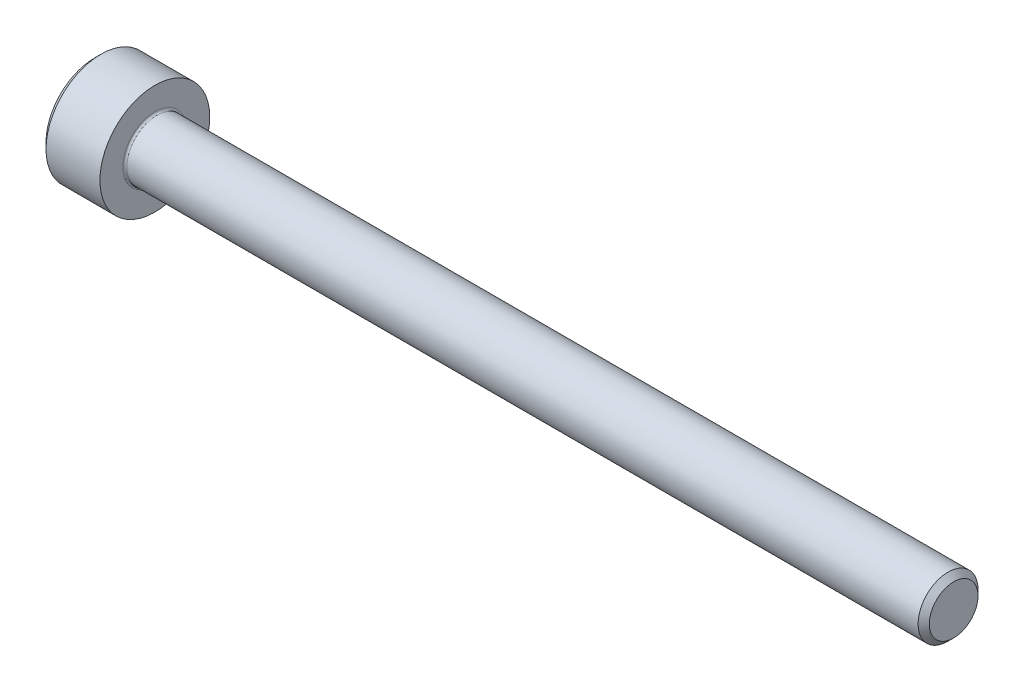
ISO-10303-21;
HEADER;
FILE_DESCRIPTION(('STEP AP214'),'2;1');
FILE_NAME('part.step','',(''),(''),'','','');
FILE_SCHEMA(('AUTOMOTIVE_DESIGN { 1 0 10303 214 1 1 1 1 }'));
ENDSEC;
DATA;
#1=APPLICATION_CONTEXT('core data for automotive mechanical design processes');
#2=APPLICATION_PROTOCOL_DEFINITION('international standard','automotive_design',2000,#1);
#3=PRODUCT_CONTEXT('',#1,'mechanical');
#4=PRODUCT('Part','Part','',(#3));
#5=PRODUCT_RELATED_PRODUCT_CATEGORY('part','',(#4));
#6=PRODUCT_DEFINITION_FORMATION('','',#4);
#7=PRODUCT_DEFINITION_CONTEXT('part definition',#1,'design');
#8=PRODUCT_DEFINITION('design','',#6,#7);
#9=PRODUCT_DEFINITION_SHAPE('','',#8);
#10=(LENGTH_UNIT() NAMED_UNIT(*) SI_UNIT(.MILLI.,.METRE.));
#11=(NAMED_UNIT(*) PLANE_ANGLE_UNIT() SI_UNIT($,.RADIAN.));
#12=(NAMED_UNIT(*) SI_UNIT($,.STERADIAN.) SOLID_ANGLE_UNIT());
#13=UNCERTAINTY_MEASURE_WITH_UNIT(LENGTH_MEASURE(1.E-05),#10,'distance_accuracy_value','');
#14=(GEOMETRIC_REPRESENTATION_CONTEXT(3) GLOBAL_UNCERTAINTY_ASSIGNED_CONTEXT((#13)) GLOBAL_UNIT_ASSIGNED_CONTEXT((#10,
#11,#12)) REPRESENTATION_CONTEXT('',''));
#15=CARTESIAN_POINT('',(0.,0.,0.));
#16=DIRECTION('',(0.,0.,1.));
#17=DIRECTION('',(1.,0.,0.));
#18=AXIS2_PLACEMENT_3D('',#15,#16,#17);
#19=CARTESIAN_POINT('',(1.3,0.,0.));
#20=DIRECTION('',(-1.,0.,0.));
#21=DIRECTION('',(0.,0.,1.));
#22=AXIS2_PLACEMENT_3D('',#19,#20,#21);
#23=CONICAL_SURFACE('',#22,1.28,1.0471975511966);
#24=DIRECTION('',(-0.5,0.,-0.86602540378444));
#25=VECTOR('',#24,1.);
#26=CARTESIAN_POINT('',(1.3,0.,-1.28));
#27=LINE('',#26,#25);
#28=CARTESIAN_POINT('',(2.03900834456273,0.,0.));
#29=VERTEX_POINT('',#28);
#30=CARTESIAN_POINT('',(1.3,0.,-1.28));
#31=VERTEX_POINT('',#30);
#32=EDGE_CURVE('E11',#29,#31,#27,.T.);
#33=ORIENTED_EDGE('',*,*,#32,.T.);
#34=CARTESIAN_POINT('',(1.3,0.,0.));
#35=DIRECTION('',(-1.,0.,0.));
#36=DIRECTION('',(0.,0.,1.));
#37=AXIS2_PLACEMENT_3D('',#34,#35,#36);
#38=CIRCLE('',#37,1.28);
#39=CARTESIAN_POINT('',(1.3,-1.10851251684408,-0.64));
#40=VERTEX_POINT('',#39);
#41=EDGE_CURVE('E241',#31,#40,#38,.T.);
#42=ORIENTED_EDGE('',*,*,#41,.T.);
#43=CARTESIAN_POINT('',(1.3,0.,0.));
#44=DIRECTION('',(-1.,0.,0.));
#45=DIRECTION('',(0.,0.,1.));
#46=AXIS2_PLACEMENT_3D('',#43,#44,#45);
#47=CIRCLE('',#46,1.28);
#48=CARTESIAN_POINT('',(1.3,-1.10851251684408,0.64));
#49=VERTEX_POINT('',#48);
#50=EDGE_CURVE('E237',#40,#49,#47,.T.);
#51=ORIENTED_EDGE('',*,*,#50,.T.);
#52=CARTESIAN_POINT('',(1.3,0.,0.));
#53=DIRECTION('',(-1.,0.,0.));
#54=DIRECTION('',(0.,0.,1.));
#55=AXIS2_PLACEMENT_3D('',#52,#53,#54);
#56=CIRCLE('',#55,1.28);
#57=CARTESIAN_POINT('',(1.3,0.,1.28));
#58=VERTEX_POINT('',#57);
#59=EDGE_CURVE('E21',#49,#58,#56,.T.);
#60=ORIENTED_EDGE('',*,*,#59,.T.);
#61=CARTESIAN_POINT('',(1.3,0.,0.));
#62=DIRECTION('',(-1.,0.,0.));
#63=DIRECTION('',(0.,0.,1.));
#64=AXIS2_PLACEMENT_3D('',#61,#62,#63);
#65=CIRCLE('',#64,1.28);
#66=CARTESIAN_POINT('',(1.3,1.10851251684408,0.64));
#67=VERTEX_POINT('',#66);
#68=EDGE_CURVE('E244',#58,#67,#65,.T.);
#69=ORIENTED_EDGE('',*,*,#68,.T.);
#70=CARTESIAN_POINT('',(1.3,0.,0.));
#71=DIRECTION('',(-1.,0.,0.));
#72=DIRECTION('',(0.,0.,1.));
#73=AXIS2_PLACEMENT_3D('',#70,#71,#72);
#74=CIRCLE('',#73,1.28);
#75=CARTESIAN_POINT('',(1.3,1.10851251684408,-0.64));
#76=VERTEX_POINT('',#75);
#77=EDGE_CURVE('E242',#67,#76,#74,.T.);
#78=ORIENTED_EDGE('',*,*,#77,.T.);
#79=CARTESIAN_POINT('',(1.3,0.,0.));
#80=DIRECTION('',(-1.,0.,0.));
#81=DIRECTION('',(0.,0.,1.));
#82=AXIS2_PLACEMENT_3D('',#79,#80,#81);
#83=CIRCLE('',#82,1.28);
#84=EDGE_CURVE('E27',#76,#31,#83,.T.);
#85=ORIENTED_EDGE('',*,*,#84,.T.);
#86=ORIENTED_EDGE('',*,*,#32,.F.);
#87=EDGE_LOOP('',(#33,#42,#51,#60,#69,#78,#85,#86));
#88=FACE_BOUND('',#87,.T.);
#89=ADVANCED_FACE('F17',(#88),#23,.F.);
#90=CARTESIAN_POINT('',(1.3,1.47801668912544,0.));
#91=DIRECTION('',(1.,0.,0.));
#92=DIRECTION('',(0.,1.,0.));
#93=AXIS2_PLACEMENT_3D('',#90,#91,#92);
#94=PLANE('',#93);
#95=DIRECTION('',(0.,-0.5,-0.866025403784439));
#96=VECTOR('',#95,1.);
#97=CARTESIAN_POINT('',(1.3,1.10851251684408,-0.64));
#98=LINE('',#97,#96);
#99=CARTESIAN_POINT('',(1.3,0.739008344562717,-1.28));
#100=VERTEX_POINT('',#99);
#101=EDGE_CURVE('E304',#76,#100,#98,.T.);
#102=ORIENTED_EDGE('',*,*,#101,.T.);
#103=DIRECTION('',(0.,-1.,0.));
#104=VECTOR('',#103,1.);
#105=CARTESIAN_POINT('',(1.3,0.739008344562717,-1.28));
#106=LINE('',#105,#104);
#107=EDGE_CURVE('E195',#100,#31,#106,.T.);
#108=ORIENTED_EDGE('',*,*,#107,.T.);
#109=ORIENTED_EDGE('',*,*,#84,.F.);
#110=EDGE_LOOP('',(#102,#108,#109));
#111=FACE_BOUND('',#110,.T.);
#112=ADVANCED_FACE('F362',(#111),#94,.F.);
#113=CARTESIAN_POINT('',(1.3,1.47801668912544,0.));
#114=DIRECTION('',(1.,0.,0.));
#115=DIRECTION('',(0.,1.,0.));
#116=AXIS2_PLACEMENT_3D('',#113,#114,#115);
#117=PLANE('',#116);
#118=DIRECTION('',(0.,-0.5,0.866025403784438));
#119=VECTOR('',#118,1.);
#120=CARTESIAN_POINT('',(1.3,1.47801668912544,0.));
#121=LINE('',#120,#119);
#122=CARTESIAN_POINT('',(1.3,1.47801668912544,0.));
#123=VERTEX_POINT('',#122);
#124=EDGE_CURVE('E204',#123,#67,#121,.T.);
#125=ORIENTED_EDGE('',*,*,#124,.F.);
#126=DIRECTION('',(0.,-0.5,-0.866025403784438));
#127=VECTOR('',#126,1.);
#128=CARTESIAN_POINT('',(1.3,1.47801668912544,0.));
#129=LINE('',#128,#127);
#130=EDGE_CURVE('E300',#123,#76,#129,.T.);
#131=ORIENTED_EDGE('',*,*,#130,.T.);
#132=ORIENTED_EDGE('',*,*,#77,.F.);
#133=EDGE_LOOP('',(#125,#131,#132));
#134=FACE_BOUND('',#133,.T.);
#135=ADVANCED_FACE('F347',(#134),#117,.F.);
#136=CARTESIAN_POINT('',(1.3,1.47801668912544,0.));
#137=DIRECTION('',(1.,0.,0.));
#138=DIRECTION('',(0.,1.,0.));
#139=AXIS2_PLACEMENT_3D('',#136,#137,#138);
#140=PLANE('',#139);
#141=DIRECTION('',(0.,1.,0.));
#142=VECTOR('',#141,1.);
#143=CARTESIAN_POINT('',(1.3,0.,1.28));
#144=LINE('',#143,#142);
#145=CARTESIAN_POINT('',(1.3,0.739008344562719,1.28));
#146=VERTEX_POINT('',#145);
#147=EDGE_CURVE('E208',#58,#146,#144,.T.);
#148=ORIENTED_EDGE('',*,*,#147,.T.);
#149=DIRECTION('',(0.,-0.5,0.866025403784439));
#150=VECTOR('',#149,1.);
#151=CARTESIAN_POINT('',(1.3,1.10851251684408,0.64));
#152=LINE('',#151,#150);
#153=EDGE_CURVE('E209',#67,#146,#152,.T.);
#154=ORIENTED_EDGE('',*,*,#153,.F.);
#155=ORIENTED_EDGE('',*,*,#68,.F.);
#156=EDGE_LOOP('',(#148,#154,#155));
#157=FACE_BOUND('',#156,.T.);
#158=ADVANCED_FACE('F350',(#157),#140,.F.);
#159=CARTESIAN_POINT('',(1.3,1.47801668912544,0.));
#160=DIRECTION('',(1.,0.,0.));
#161=DIRECTION('',(0.,1.,0.));
#162=AXIS2_PLACEMENT_3D('',#159,#160,#161);
#163=PLANE('',#162);
#164=DIRECTION('',(0.,-0.5,-0.866025403784439));
#165=VECTOR('',#164,1.);
#166=CARTESIAN_POINT('',(1.3,-0.739008344562723,1.28));
#167=LINE('',#166,#165);
#168=CARTESIAN_POINT('',(1.3,-0.739008344562723,1.28));
#169=VERTEX_POINT('',#168);
#170=EDGE_CURVE('E307',#169,#49,#167,.T.);
#171=ORIENTED_EDGE('',*,*,#170,.F.);
#172=DIRECTION('',(0.,1.,0.));
#173=VECTOR('',#172,1.);
#174=CARTESIAN_POINT('',(1.3,-0.739008344562723,1.28));
#175=LINE('',#174,#173);
#176=EDGE_CURVE('E219',#169,#58,#175,.T.);
#177=ORIENTED_EDGE('',*,*,#176,.T.);
#178=ORIENTED_EDGE('',*,*,#59,.F.);
#179=EDGE_LOOP('',(#171,#177,#178));
#180=FACE_BOUND('',#179,.T.);
#181=ADVANCED_FACE('F352',(#180),#163,.F.);
#182=CARTESIAN_POINT('',(1.3,1.47801668912544,0.));
#183=DIRECTION('',(1.,0.,0.));
#184=DIRECTION('',(0.,1.,0.));
#185=AXIS2_PLACEMENT_3D('',#182,#183,#184);
#186=PLANE('',#185);
#187=DIRECTION('',(0.,0.5,-0.866025403784439));
#188=VECTOR('',#187,1.);
#189=CARTESIAN_POINT('',(1.3,-1.47801668912545,0.));
#190=LINE('',#189,#188);
#191=CARTESIAN_POINT('',(1.3,-1.47801668912545,0.));
#192=VERTEX_POINT('',#191);
#193=EDGE_CURVE('E297',#192,#40,#190,.T.);
#194=ORIENTED_EDGE('',*,*,#193,.F.);
#195=DIRECTION('',(0.,-0.5,-0.866025403784439));
#196=VECTOR('',#195,1.);
#197=CARTESIAN_POINT('',(1.3,-1.10851251684408,0.64));
#198=LINE('',#197,#196);
#199=EDGE_CURVE('E311',#49,#192,#198,.T.);
#200=ORIENTED_EDGE('',*,*,#199,.F.);
#201=ORIENTED_EDGE('',*,*,#50,.F.);
#202=EDGE_LOOP('',(#194,#200,#201));
#203=FACE_BOUND('',#202,.T.);
#204=ADVANCED_FACE('F359',(#203),#186,.F.);
#205=CARTESIAN_POINT('',(1.3,1.47801668912544,0.));
#206=DIRECTION('',(1.,0.,0.));
#207=DIRECTION('',(0.,1.,0.));
#208=AXIS2_PLACEMENT_3D('',#205,#206,#207);
#209=PLANE('',#208);
#210=DIRECTION('',(0.,-1.,0.));
#211=VECTOR('',#210,1.);
#212=CARTESIAN_POINT('',(1.3,0.,-1.28));
#213=LINE('',#212,#211);
#214=CARTESIAN_POINT('',(1.3,-0.739008344562725,-1.28));
#215=VERTEX_POINT('',#214);
#216=EDGE_CURVE('E165',#31,#215,#213,.T.);
#217=ORIENTED_EDGE('',*,*,#216,.T.);
#218=DIRECTION('',(0.,0.5,-0.866025403784439));
#219=VECTOR('',#218,1.);
#220=CARTESIAN_POINT('',(1.3,-1.10851251684409,-0.64));
#221=LINE('',#220,#219);
#222=EDGE_CURVE('E161',#40,#215,#221,.T.);
#223=ORIENTED_EDGE('',*,*,#222,.F.);
#224=ORIENTED_EDGE('',*,*,#41,.F.);
#225=EDGE_LOOP('',(#217,#223,#224));
#226=FACE_BOUND('',#225,.T.);
#227=ADVANCED_FACE('F374',(#226),#209,.F.);
#228=CARTESIAN_POINT('',(1.3,1.47801668912544,0.));
#229=DIRECTION('',(0.,0.866025403784439,-0.5));
#230=DIRECTION('',(-1.,0.,0.));
#231=AXIS2_PLACEMENT_3D('',#228,#229,#230);
#232=PLANE('',#231);
#233=DIRECTION('',(0.,-0.5,-0.866025403784439));
#234=VECTOR('',#233,1.);
#235=CARTESIAN_POINT('',(0.,1.47801668912544,0.));
#236=LINE('',#235,#234);
#237=CARTESIAN_POINT('',(0.,1.47801668912544,0.));
#238=VERTEX_POINT('',#237);
#239=CARTESIAN_POINT('',(0.,0.739008344562717,-1.28));
#240=VERTEX_POINT('',#239);
#241=EDGE_CURVE('E176',#238,#240,#236,.T.);
#242=ORIENTED_EDGE('',*,*,#241,.T.);
#243=DIRECTION('',(-1.,0.,0.));
#244=VECTOR('',#243,1.);
#245=CARTESIAN_POINT('',(1.3,0.739008344562717,-1.28));
#246=LINE('',#245,#244);
#247=EDGE_CURVE('E171',#100,#240,#246,.T.);
#248=ORIENTED_EDGE('',*,*,#247,.F.);
#249=ORIENTED_EDGE('',*,*,#101,.F.);
#250=ORIENTED_EDGE('',*,*,#130,.F.);
#251=DIRECTION('',(-1.,0.,0.));
#252=VECTOR('',#251,1.);
#253=CARTESIAN_POINT('',(1.3,1.47801668912544,0.));
#254=LINE('',#253,#252);
#255=EDGE_CURVE('E201',#123,#238,#254,.T.);
#256=ORIENTED_EDGE('',*,*,#255,.T.);
#257=EDGE_LOOP('',(#242,#248,#249,#250,#256));
#258=FACE_BOUND('',#257,.T.);
#259=ADVANCED_FACE('F344',(#258),#232,.F.);
#260=CARTESIAN_POINT('',(1.3,0.739008344562717,-1.28));
#261=DIRECTION('',(0.,0.,-1.));
#262=DIRECTION('',(0.,-1.,0.));
#263=AXIS2_PLACEMENT_3D('',#260,#261,#262);
#264=PLANE('',#263);
#265=DIRECTION('',(0.,-1.,0.));
#266=VECTOR('',#265,1.);
#267=CARTESIAN_POINT('',(0.,0.739008344562717,-1.28));
#268=LINE('',#267,#266);
#269=CARTESIAN_POINT('',(0.,-0.739008344562725,-1.28));
#270=VERTEX_POINT('',#269);
#271=EDGE_CURVE('E167',#240,#270,#268,.T.);
#272=ORIENTED_EDGE('',*,*,#271,.T.);
#273=DIRECTION('',(-1.,0.,0.));
#274=VECTOR('',#273,1.);
#275=CARTESIAN_POINT('',(1.3,-0.739008344562725,-1.28));
#276=LINE('',#275,#274);
#277=EDGE_CURVE('E152',#215,#270,#276,.T.);
#278=ORIENTED_EDGE('',*,*,#277,.F.);
#279=ORIENTED_EDGE('',*,*,#216,.F.);
#280=ORIENTED_EDGE('',*,*,#107,.F.);
#281=ORIENTED_EDGE('',*,*,#247,.T.);
#282=EDGE_LOOP('',(#272,#278,#279,#280,#281));
#283=FACE_BOUND('',#282,.T.);
#284=ADVANCED_FACE('F168',(#283),#264,.F.);
#285=CARTESIAN_POINT('',(1.3,-1.47801668912545,0.));
#286=DIRECTION('',(0.,0.866025403784439,0.5));
#287=DIRECTION('',(1.,0.,0.));
#288=AXIS2_PLACEMENT_3D('',#285,#286,#287);
#289=PLANE('',#288);
#290=DIRECTION('',(0.,0.5,-0.866025403784439));
#291=VECTOR('',#290,1.);
#292=CARTESIAN_POINT('',(0.,-1.47801668912545,0.));
#293=LINE('',#292,#291);
#294=CARTESIAN_POINT('',(0.,-1.47801668912545,0.));
#295=VERTEX_POINT('',#294);
#296=EDGE_CURVE('E157',#295,#270,#293,.T.);
#297=ORIENTED_EDGE('',*,*,#296,.F.);
#298=DIRECTION('',(-1.,0.,0.));
#299=VECTOR('',#298,1.);
#300=CARTESIAN_POINT('',(1.3,-1.47801668912545,0.));
#301=LINE('',#300,#299);
#302=EDGE_CURVE('E230',#192,#295,#301,.T.);
#303=ORIENTED_EDGE('',*,*,#302,.F.);
#304=ORIENTED_EDGE('',*,*,#193,.T.);
#305=ORIENTED_EDGE('',*,*,#222,.T.);
#306=ORIENTED_EDGE('',*,*,#277,.T.);
#307=EDGE_LOOP('',(#297,#303,#304,#305,#306));
#308=FACE_BOUND('',#307,.T.);
#309=ADVANCED_FACE('F154',(#308),#289,.T.);
#310=CARTESIAN_POINT('',(1.3,-0.739008344562723,1.28));
#311=DIRECTION('',(0.,0.866025403784439,-0.5));
#312=DIRECTION('',(-1.,0.,0.));
#313=AXIS2_PLACEMENT_3D('',#310,#311,#312);
#314=PLANE('',#313);
#315=DIRECTION('',(0.,-0.5,-0.866025403784439));
#316=VECTOR('',#315,1.);
#317=CARTESIAN_POINT('',(0.,-0.739008344562723,1.28));
#318=LINE('',#317,#316);
#319=CARTESIAN_POINT('',(0.,-0.739008344562723,1.28));
#320=VERTEX_POINT('',#319);
#321=EDGE_CURVE('E183',#320,#295,#318,.T.);
#322=ORIENTED_EDGE('',*,*,#321,.F.);
#323=DIRECTION('',(-1.,0.,0.));
#324=VECTOR('',#323,1.);
#325=CARTESIAN_POINT('',(1.3,-0.739008344562723,1.28));
#326=LINE('',#325,#324);
#327=EDGE_CURVE('E249',#169,#320,#326,.T.);
#328=ORIENTED_EDGE('',*,*,#327,.F.);
#329=ORIENTED_EDGE('',*,*,#170,.T.);
#330=ORIENTED_EDGE('',*,*,#199,.T.);
#331=ORIENTED_EDGE('',*,*,#302,.T.);
#332=EDGE_LOOP('',(#322,#328,#329,#330,#331));
#333=FACE_BOUND('',#332,.T.);
#334=ADVANCED_FACE('F339',(#333),#314,.T.);
#335=CARTESIAN_POINT('',(1.3,-0.739008344562723,1.28));
#336=DIRECTION('',(0.,0.,1.));
#337=DIRECTION('',(0.,-1.,0.));
#338=AXIS2_PLACEMENT_3D('',#335,#336,#337);
#339=PLANE('',#338);
#340=DIRECTION('',(0.,1.,0.));
#341=VECTOR('',#340,1.);
#342=CARTESIAN_POINT('',(0.,-0.739008344562723,1.28));
#343=LINE('',#342,#341);
#344=CARTESIAN_POINT('',(0.,0.739008344562719,1.28));
#345=VERTEX_POINT('',#344);
#346=EDGE_CURVE('E190',#320,#345,#343,.T.);
#347=ORIENTED_EDGE('',*,*,#346,.T.);
#348=DIRECTION('',(-1.,0.,0.));
#349=VECTOR('',#348,1.);
#350=CARTESIAN_POINT('',(1.3,0.739008344562719,1.28));
#351=LINE('',#350,#349);
#352=EDGE_CURVE('E206',#146,#345,#351,.T.);
#353=ORIENTED_EDGE('',*,*,#352,.F.);
#354=ORIENTED_EDGE('',*,*,#147,.F.);
#355=ORIENTED_EDGE('',*,*,#176,.F.);
#356=ORIENTED_EDGE('',*,*,#327,.T.);
#357=EDGE_LOOP('',(#347,#353,#354,#355,#356));
#358=FACE_BOUND('',#357,.T.);
#359=ADVANCED_FACE('F336',(#358),#339,.F.);
#360=CARTESIAN_POINT('',(1.3,1.47801668912544,0.));
#361=DIRECTION('',(0.,-0.866025403784439,-0.5));
#362=DIRECTION('',(0.,0.5,-0.866025403784439));
#363=AXIS2_PLACEMENT_3D('',#360,#361,#362);
#364=PLANE('',#363);
#365=DIRECTION('',(0.,-0.5,0.866025403784439));
#366=VECTOR('',#365,1.);
#367=CARTESIAN_POINT('',(0.,1.47801668912544,0.));
#368=LINE('',#367,#366);
#369=EDGE_CURVE('E250',#238,#345,#368,.T.);
#370=ORIENTED_EDGE('',*,*,#369,.F.);
#371=ORIENTED_EDGE('',*,*,#255,.F.);
#372=ORIENTED_EDGE('',*,*,#124,.T.);
#373=ORIENTED_EDGE('',*,*,#153,.T.);
#374=ORIENTED_EDGE('',*,*,#352,.T.);
#375=EDGE_LOOP('',(#370,#371,#372,#373,#374));
#376=FACE_BOUND('',#375,.T.);
#377=ADVANCED_FACE('F341',(#376),#364,.T.);
#378=CARTESIAN_POINT('',(3.1,0.,0.));
#379=DIRECTION('',(1.,0.,0.));
#380=DIRECTION('',(0.,0.,-1.));
#381=AXIS2_PLACEMENT_3D('',#378,#379,#380);
#382=TOROIDAL_SURFACE('',#381,1.6,0.1);
#383=CARTESIAN_POINT('',(3.1,0.,0.));
#384=DIRECTION('',(1.,0.,0.));
#385=DIRECTION('',(0.,0.,-1.));
#386=AXIS2_PLACEMENT_3D('',#383,#384,#385);
#387=CIRCLE('',#386,1.5);
#388=CARTESIAN_POINT('',(3.1,0.,1.5));
#389=VERTEX_POINT('',#388);
#390=CARTESIAN_POINT('',(3.1,0.,-1.5));
#391=VERTEX_POINT('',#390);
#392=EDGE_CURVE('E269',#389,#391,#387,.T.);
#393=ORIENTED_EDGE('',*,*,#392,.F.);
#394=CARTESIAN_POINT('',(3.1,0.,1.6));
#395=DIRECTION('',(0.,1.,0.));
#396=DIRECTION('',(0.,0.,1.));
#397=AXIS2_PLACEMENT_3D('',#394,#395,#396);
#398=CIRCLE('',#397,0.1);
#399=CARTESIAN_POINT('',(3.,0.,1.6));
#400=VERTEX_POINT('',#399);
#401=EDGE_CURVE('E205',#389,#400,#398,.T.);
#402=ORIENTED_EDGE('',*,*,#401,.T.);
#403=CARTESIAN_POINT('',(3.,0.,0.));
#404=DIRECTION('',(-1.,0.,0.));
#405=DIRECTION('',(0.,0.,-1.));
#406=AXIS2_PLACEMENT_3D('',#403,#404,#405);
#407=CIRCLE('',#406,1.6);
#408=EDGE_CURVE('E267',#400,#400,#407,.T.);
#409=ORIENTED_EDGE('',*,*,#408,.F.);
#410=ORIENTED_EDGE('',*,*,#401,.F.);
#411=CARTESIAN_POINT('',(3.1,0.,0.));
#412=DIRECTION('',(1.,0.,0.));
#413=DIRECTION('',(0.,0.,-1.));
#414=AXIS2_PLACEMENT_3D('',#411,#412,#413);
#415=CIRCLE('',#414,1.5);
#416=EDGE_CURVE('E253',#391,#389,#415,.T.);
#417=ORIENTED_EDGE('',*,*,#416,.F.);
#418=EDGE_LOOP('',(#393,#402,#409,#410,#417));
#419=FACE_BOUND('',#418,.T.);
#420=ADVANCED_FACE('F397',(#419),#382,.F.);
#421=CARTESIAN_POINT('',(0.,0.,0.));
#422=DIRECTION('',(1.,0.,0.));
#423=DIRECTION('',(0.,0.,-1.));
#424=AXIS2_PLACEMENT_3D('',#421,#422,#423);
#425=CONICAL_SURFACE('',#424,2.45,0.785398163397442);
#426=CARTESIAN_POINT('',(0.3,0.,0.));
#427=DIRECTION('',(-1.,0.,0.));
#428=DIRECTION('',(0.,0.,1.));
#429=AXIS2_PLACEMENT_3D('',#426,#427,#428);
#430=CIRCLE('',#429,2.75);
#431=CARTESIAN_POINT('',(0.3,0.,2.75));
#432=VERTEX_POINT('',#431);
#433=CARTESIAN_POINT('',(0.3,0.,-2.75));
#434=VERTEX_POINT('',#433);
#435=EDGE_CURVE('E315',#432,#434,#430,.T.);
#436=ORIENTED_EDGE('',*,*,#435,.T.);
#437=CARTESIAN_POINT('',(0.3,0.,0.));
#438=DIRECTION('',(-1.,0.,0.));
#439=DIRECTION('',(0.,0.,1.));
#440=AXIS2_PLACEMENT_3D('',#437,#438,#439);
#441=CIRCLE('',#440,2.75);
#442=EDGE_CURVE('E236',#434,#432,#441,.T.);
#443=ORIENTED_EDGE('',*,*,#442,.T.);
#444=DIRECTION('',(-0.707106781186552,0.,-0.707106781186543));
#445=VECTOR('',#444,1.);
#446=CARTESIAN_POINT('',(0.,0.,2.45));
#447=LINE('',#446,#445);
#448=CARTESIAN_POINT('',(0.,0.,2.45));
#449=VERTEX_POINT('',#448);
#450=EDGE_CURVE('E235',#432,#449,#447,.T.);
#451=ORIENTED_EDGE('',*,*,#450,.T.);
#452=CARTESIAN_POINT('',(0.,0.,0.));
#453=DIRECTION('',(-1.,0.,0.));
#454=DIRECTION('',(0.,0.,1.));
#455=AXIS2_PLACEMENT_3D('',#452,#453,#454);
#456=CIRCLE('',#455,2.45);
#457=EDGE_CURVE('E252',#449,#449,#456,.T.);
#458=ORIENTED_EDGE('',*,*,#457,.F.);
#459=ORIENTED_EDGE('',*,*,#450,.F.);
#460=EDGE_LOOP('',(#436,#443,#451,#458,#459));
#461=FACE_BOUND('',#460,.T.);
#462=ADVANCED_FACE('F386',(#461),#425,.T.);
#463=CARTESIAN_POINT('',(-31.75,0.,0.));
#464=DIRECTION('',(-1.,0.,0.));
#465=DIRECTION('',(0.,0.,1.));
#466=AXIS2_PLACEMENT_3D('',#463,#464,#465);
#467=CYLINDRICAL_SURFACE('',#466,2.75);
#468=ORIENTED_EDGE('',*,*,#435,.F.);
#469=ORIENTED_EDGE('',*,*,#442,.F.);
#470=DIRECTION('',(1.,0.,0.));
#471=VECTOR('',#470,1.);
#472=CARTESIAN_POINT('',(-31.75,0.,-2.75));
#473=LINE('',#472,#471);
#474=CARTESIAN_POINT('',(3.,0.,-2.75));
#475=VERTEX_POINT('',#474);
#476=EDGE_CURVE('E232',#434,#475,#473,.T.);
#477=ORIENTED_EDGE('',*,*,#476,.T.);
#478=CARTESIAN_POINT('',(3.,0.,0.));
#479=DIRECTION('',(-1.,0.,0.));
#480=DIRECTION('',(0.,0.,1.));
#481=AXIS2_PLACEMENT_3D('',#478,#479,#480);
#482=CIRCLE('',#481,2.75);
#483=EDGE_CURVE('E256',#475,#475,#482,.T.);
#484=ORIENTED_EDGE('',*,*,#483,.T.);
#485=ORIENTED_EDGE('',*,*,#476,.F.);
#486=EDGE_LOOP('',(#468,#469,#477,#484,#485));
#487=FACE_BOUND('',#486,.T.);
#488=ADVANCED_FACE('F383',(#487),#467,.T.);
#489=CARTESIAN_POINT('',(3.,2.75,0.));
#490=DIRECTION('',(1.,0.,0.));
#491=DIRECTION('',(0.,1.,0.));
#492=AXIS2_PLACEMENT_3D('',#489,#490,#491);
#493=PLANE('',#492);
#494=ORIENTED_EDGE('',*,*,#408,.T.);
#495=EDGE_LOOP('',(#494));
#496=FACE_BOUND('',#495,.T.);
#497=ORIENTED_EDGE('',*,*,#483,.F.);
#498=EDGE_LOOP('',(#497));
#499=FACE_BOUND('',#498,.T.);
#500=ADVANCED_FACE('F19',(#496,#499),#493,.T.);
#501=CARTESIAN_POINT('',(-31.75,0.,0.));
#502=DIRECTION('',(-1.,0.,0.));
#503=DIRECTION('',(0.,0.,1.));
#504=AXIS2_PLACEMENT_3D('',#501,#502,#503);
#505=CYLINDRICAL_SURFACE('',#504,1.5);
#506=ORIENTED_EDGE('',*,*,#392,.T.);
#507=DIRECTION('',(1.,0.,0.));
#508=VECTOR('',#507,1.);
#509=CARTESIAN_POINT('',(-31.75,0.,-1.5));
#510=LINE('',#509,#508);
#511=CARTESIAN_POINT('',(42.7195,0.,-1.49999999999997));
#512=VERTEX_POINT('',#511);
#513=EDGE_CURVE('E257',#391,#512,#510,.T.);
#514=ORIENTED_EDGE('',*,*,#513,.T.);
#515=CARTESIAN_POINT('',(42.7195,0.,0.));
#516=DIRECTION('',(-1.,0.,0.));
#517=DIRECTION('',(0.,0.,1.));
#518=AXIS2_PLACEMENT_3D('',#515,#516,#517);
#519=CIRCLE('',#518,1.49999999999997);
#520=EDGE_CURVE('E286',#512,#512,#519,.T.);
#521=ORIENTED_EDGE('',*,*,#520,.T.);
#522=ORIENTED_EDGE('',*,*,#513,.F.);
#523=ORIENTED_EDGE('',*,*,#416,.T.);
#524=EDGE_LOOP('',(#506,#514,#521,#522,#523));
#525=FACE_BOUND('',#524,.T.);
#526=ADVANCED_FACE('F375',(#525),#505,.T.);
#527=CARTESIAN_POINT('',(43.,0.,0.));
#528=DIRECTION('',(-1.,0.,0.));
#529=DIRECTION('',(0.,0.,1.));
#530=AXIS2_PLACEMENT_3D('',#527,#528,#529);
#531=CONICAL_SURFACE('',#530,1.2195,0.7853981633974);
#532=ORIENTED_EDGE('',*,*,#520,.F.);
#533=DIRECTION('',(0.707106781186582,0.,0.707106781186513));
#534=VECTOR('',#533,1.);
#535=CARTESIAN_POINT('',(43.,0.,-1.2195));
#536=LINE('',#535,#534);
#537=CARTESIAN_POINT('',(43.,0.,-1.2195));
#538=VERTEX_POINT('',#537);
#539=EDGE_CURVE('E276',#512,#538,#536,.T.);
#540=ORIENTED_EDGE('',*,*,#539,.T.);
#541=CARTESIAN_POINT('',(43.,0.,0.));
#542=DIRECTION('',(-1.,0.,0.));
#543=DIRECTION('',(0.,0.,1.));
#544=AXIS2_PLACEMENT_3D('',#541,#542,#543);
#545=CIRCLE('',#544,1.2195);
#546=EDGE_CURVE('E200',#538,#538,#545,.T.);
#547=ORIENTED_EDGE('',*,*,#546,.T.);
#548=ORIENTED_EDGE('',*,*,#539,.F.);
#549=EDGE_LOOP('',(#532,#540,#547,#548));
#550=FACE_BOUND('',#549,.T.);
#551=ADVANCED_FACE('F378',(#550),#531,.T.);
#552=CARTESIAN_POINT('',(43.,1.2195,0.));
#553=DIRECTION('',(1.,0.,0.));
#554=DIRECTION('',(0.,1.,0.));
#555=AXIS2_PLACEMENT_3D('',#552,#553,#554);
#556=PLANE('',#555);
#557=ORIENTED_EDGE('',*,*,#546,.F.);
#558=EDGE_LOOP('',(#557));
#559=FACE_BOUND('',#558,.T.);
#560=ADVANCED_FACE('F388',(#559),#556,.T.);
#561=CARTESIAN_POINT('',(0.,0.,0.));
#562=DIRECTION('',(-1.,0.,0.));
#563=DIRECTION('',(0.,0.,1.));
#564=AXIS2_PLACEMENT_3D('',#561,#562,#563);
#565=PLANE('',#564);
#566=ORIENTED_EDGE('',*,*,#369,.T.);
#567=ORIENTED_EDGE('',*,*,#346,.F.);
#568=ORIENTED_EDGE('',*,*,#321,.T.);
#569=ORIENTED_EDGE('',*,*,#296,.T.);
#570=ORIENTED_EDGE('',*,*,#271,.F.);
#571=ORIENTED_EDGE('',*,*,#241,.F.);
#572=EDGE_LOOP('',(#566,#567,#568,#569,#570,#571));
#573=FACE_BOUND('',#572,.T.);
#574=ORIENTED_EDGE('',*,*,#457,.T.);
#575=EDGE_LOOP('',(#574));
#576=FACE_BOUND('',#575,.T.);
#577=ADVANCED_FACE('F179',(#573,#576),#565,.T.);
#578=CLOSED_SHELL('',(#89,#112,#135,#158,#181,#204,#227,#259,#284,#309,#334,#359,#377,#420,#462,
#488,#500,#526,#551,#560,#577));
#579=MANIFOLD_SOLID_BREP('B1',#578);
#580=ADVANCED_BREP_SHAPE_REPRESENTATION('',(#18,#579),#14);
#581=SHAPE_DEFINITION_REPRESENTATION(#9,#580);
ENDSEC;
END-ISO-10303-21;
